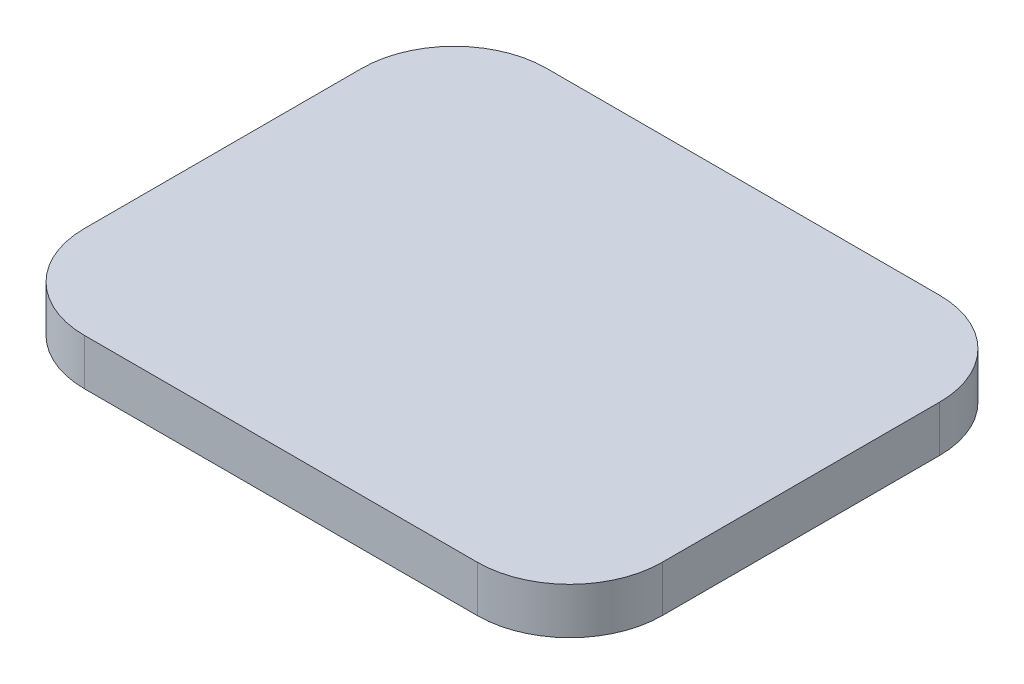
ISO-10303-21;
HEADER;
FILE_DESCRIPTION(('STEP AP214'),'2;1');
FILE_NAME('part.step','',(''),(''),'','','');
FILE_SCHEMA(('AUTOMOTIVE_DESIGN { 1 0 10303 214 1 1 1 1 }'));
ENDSEC;
DATA;
#1=APPLICATION_CONTEXT('core data for automotive mechanical design processes');
#2=APPLICATION_PROTOCOL_DEFINITION('international standard','automotive_design',2000,#1);
#3=PRODUCT_CONTEXT('',#1,'mechanical');
#4=PRODUCT('Part','Part','',(#3));
#5=PRODUCT_RELATED_PRODUCT_CATEGORY('part','',(#4));
#6=PRODUCT_DEFINITION_FORMATION('','',#4);
#7=PRODUCT_DEFINITION_CONTEXT('part definition',#1,'design');
#8=PRODUCT_DEFINITION('design','',#6,#7);
#9=PRODUCT_DEFINITION_SHAPE('','',#8);
#10=(LENGTH_UNIT() NAMED_UNIT(*) SI_UNIT(.MILLI.,.METRE.));
#11=(NAMED_UNIT(*) PLANE_ANGLE_UNIT() SI_UNIT($,.RADIAN.));
#12=(NAMED_UNIT(*) SI_UNIT($,.STERADIAN.) SOLID_ANGLE_UNIT());
#13=UNCERTAINTY_MEASURE_WITH_UNIT(LENGTH_MEASURE(1.E-05),#10,'distance_accuracy_value','');
#14=(GEOMETRIC_REPRESENTATION_CONTEXT(3) GLOBAL_UNCERTAINTY_ASSIGNED_CONTEXT((#13)) GLOBAL_UNIT_ASSIGNED_CONTEXT((#10,
#11,#12)) REPRESENTATION_CONTEXT('',''));
#15=CARTESIAN_POINT('',(0.,0.,0.));
#16=DIRECTION('',(0.,0.,1.));
#17=DIRECTION('',(1.,0.,0.));
#18=AXIS2_PLACEMENT_3D('',#15,#16,#17);
#19=CARTESIAN_POINT('',(12.5,2.,-10.));
#20=DIRECTION('',(-1.,0.,0.));
#21=DIRECTION('',(0.,0.,1.));
#22=AXIS2_PLACEMENT_3D('',#19,#20,#21);
#23=PLANE('',#22);
#24=DIRECTION('',(0.,0.,-1.));
#25=VECTOR('',#24,1.);
#26=CARTESIAN_POINT('',(12.5,0.,-10.));
#27=LINE('',#26,#25);
#28=CARTESIAN_POINT('',(12.5,0.,6.));
#29=VERTEX_POINT('',#28);
#30=CARTESIAN_POINT('',(12.5,0.,-6.));
#31=VERTEX_POINT('',#30);
#32=EDGE_CURVE('E144',#29,#31,#27,.T.);
#33=ORIENTED_EDGE('',*,*,#32,.T.);
#34=DIRECTION('',(0.,-1.,0.));
#35=VECTOR('',#34,1.);
#36=CARTESIAN_POINT('',(12.5,2.,-6.));
#37=LINE('',#36,#35);
#38=CARTESIAN_POINT('',(12.5,2.,-6.));
#39=VERTEX_POINT('',#38);
#40=EDGE_CURVE('E178',#31,#39,#37,.F.);
#41=ORIENTED_EDGE('',*,*,#40,.T.);
#42=DIRECTION('',(0.,0.,-1.));
#43=VECTOR('',#42,1.);
#44=CARTESIAN_POINT('',(12.5,2.,-10.));
#45=LINE('',#44,#43);
#46=CARTESIAN_POINT('',(12.5,2.,6.));
#47=VERTEX_POINT('',#46);
#48=EDGE_CURVE('E142',#47,#39,#45,.T.);
#49=ORIENTED_EDGE('',*,*,#48,.F.);
#50=DIRECTION('',(0.,-1.,0.));
#51=VECTOR('',#50,1.);
#52=CARTESIAN_POINT('',(12.5,2.,6.));
#53=LINE('',#52,#51);
#54=EDGE_CURVE('E174',#47,#29,#53,.T.);
#55=ORIENTED_EDGE('',*,*,#54,.T.);
#56=EDGE_LOOP('',(#33,#41,#49,#55));
#57=FACE_BOUND('',#56,.T.);
#58=ADVANCED_FACE('F43',(#57),#23,.F.);
#59=CARTESIAN_POINT('',(-12.5,2.,-10.));
#60=DIRECTION('',(0.,0.,1.));
#61=DIRECTION('',(1.,0.,0.));
#62=AXIS2_PLACEMENT_3D('',#59,#60,#61);
#63=PLANE('',#62);
#64=DIRECTION('',(-1.,0.,0.));
#65=VECTOR('',#64,1.);
#66=CARTESIAN_POINT('',(-12.5,0.,-10.));
#67=LINE('',#66,#65);
#68=CARTESIAN_POINT('',(8.49999999999999,0.,-10.));
#69=VERTEX_POINT('',#68);
#70=CARTESIAN_POINT('',(-8.5,0.,-10.));
#71=VERTEX_POINT('',#70);
#72=EDGE_CURVE('E138',#69,#71,#67,.T.);
#73=ORIENTED_EDGE('',*,*,#72,.T.);
#74=DIRECTION('',(0.,-1.,0.));
#75=VECTOR('',#74,1.);
#76=CARTESIAN_POINT('',(-8.5,2.,-10.));
#77=LINE('',#76,#75);
#78=CARTESIAN_POINT('',(-8.5,2.,-10.));
#79=VERTEX_POINT('',#78);
#80=EDGE_CURVE('E114',#71,#79,#77,.F.);
#81=ORIENTED_EDGE('',*,*,#80,.T.);
#82=DIRECTION('',(-1.,0.,0.));
#83=VECTOR('',#82,1.);
#84=CARTESIAN_POINT('',(-12.5,2.,-10.));
#85=LINE('',#84,#83);
#86=CARTESIAN_POINT('',(8.49999999999999,2.,-10.));
#87=VERTEX_POINT('',#86);
#88=EDGE_CURVE('E197',#87,#79,#85,.T.);
#89=ORIENTED_EDGE('',*,*,#88,.F.);
#90=DIRECTION('',(0.,-1.,0.));
#91=VECTOR('',#90,1.);
#92=CARTESIAN_POINT('',(8.5,2.,-10.));
#93=LINE('',#92,#91);
#94=EDGE_CURVE('E120',#87,#69,#93,.T.);
#95=ORIENTED_EDGE('',*,*,#94,.T.);
#96=EDGE_LOOP('',(#73,#81,#89,#95));
#97=FACE_BOUND('',#96,.T.);
#98=ADVANCED_FACE('F218',(#97),#63,.F.);
#99=CARTESIAN_POINT('',(-12.5,2.,-10.));
#100=DIRECTION('',(1.,0.,0.));
#101=DIRECTION('',(0.,0.,-1.));
#102=AXIS2_PLACEMENT_3D('',#99,#100,#101);
#103=PLANE('',#102);
#104=DIRECTION('',(0.,0.,1.));
#105=VECTOR('',#104,1.);
#106=CARTESIAN_POINT('',(-12.5,2.,-10.));
#107=LINE('',#106,#105);
#108=CARTESIAN_POINT('',(-12.5,2.,-6.));
#109=VERTEX_POINT('',#108);
#110=CARTESIAN_POINT('',(-12.5,2.,6.));
#111=VERTEX_POINT('',#110);
#112=EDGE_CURVE('E129',#109,#111,#107,.T.);
#113=ORIENTED_EDGE('',*,*,#112,.F.);
#114=DIRECTION('',(0.,-1.,0.));
#115=VECTOR('',#114,1.);
#116=CARTESIAN_POINT('',(-12.5,2.,-6.));
#117=LINE('',#116,#115);
#118=CARTESIAN_POINT('',(-12.5,0.,-6.));
#119=VERTEX_POINT('',#118);
#120=EDGE_CURVE('E113',#109,#119,#117,.T.);
#121=ORIENTED_EDGE('',*,*,#120,.T.);
#122=DIRECTION('',(0.,0.,1.));
#123=VECTOR('',#122,1.);
#124=CARTESIAN_POINT('',(-12.5,0.,-10.));
#125=LINE('',#124,#123);
#126=CARTESIAN_POINT('',(-12.5,0.,6.));
#127=VERTEX_POINT('',#126);
#128=EDGE_CURVE('E127',#119,#127,#125,.T.);
#129=ORIENTED_EDGE('',*,*,#128,.T.);
#130=DIRECTION('',(0.,-1.,0.));
#131=VECTOR('',#130,1.);
#132=CARTESIAN_POINT('',(-12.5,2.,6.));
#133=LINE('',#132,#131);
#134=EDGE_CURVE('E132',#127,#111,#133,.F.);
#135=ORIENTED_EDGE('',*,*,#134,.T.);
#136=EDGE_LOOP('',(#113,#121,#129,#135));
#137=FACE_BOUND('',#136,.T.);
#138=ADVANCED_FACE('F126',(#137),#103,.F.);
#139=CARTESIAN_POINT('',(-12.5,2.,10.));
#140=DIRECTION('',(0.,0.,-1.));
#141=DIRECTION('',(-1.,0.,0.));
#142=AXIS2_PLACEMENT_3D('',#139,#140,#141);
#143=PLANE('',#142);
#144=DIRECTION('',(1.,0.,0.));
#145=VECTOR('',#144,1.);
#146=CARTESIAN_POINT('',(-12.5,0.,10.));
#147=LINE('',#146,#145);
#148=CARTESIAN_POINT('',(-8.5,0.,10.));
#149=VERTEX_POINT('',#148);
#150=CARTESIAN_POINT('',(8.5,0.,10.));
#151=VERTEX_POINT('',#150);
#152=EDGE_CURVE('E137',#149,#151,#147,.T.);
#153=ORIENTED_EDGE('',*,*,#152,.T.);
#154=DIRECTION('',(0.,-1.,0.));
#155=VECTOR('',#154,1.);
#156=CARTESIAN_POINT('',(8.5,2.,10.));
#157=LINE('',#156,#155);
#158=CARTESIAN_POINT('',(8.5,2.,10.));
#159=VERTEX_POINT('',#158);
#160=EDGE_CURVE('E11',#151,#159,#157,.F.);
#161=ORIENTED_EDGE('',*,*,#160,.T.);
#162=DIRECTION('',(1.,0.,0.));
#163=VECTOR('',#162,1.);
#164=CARTESIAN_POINT('',(-12.5,2.,10.));
#165=LINE('',#164,#163);
#166=CARTESIAN_POINT('',(-8.5,2.,10.));
#167=VERTEX_POINT('',#166);
#168=EDGE_CURVE('E149',#167,#159,#165,.T.);
#169=ORIENTED_EDGE('',*,*,#168,.F.);
#170=DIRECTION('',(0.,-1.,0.));
#171=VECTOR('',#170,1.);
#172=CARTESIAN_POINT('',(-8.5,2.,10.));
#173=LINE('',#172,#171);
#174=EDGE_CURVE('E52',#167,#149,#173,.T.);
#175=ORIENTED_EDGE('',*,*,#174,.T.);
#176=EDGE_LOOP('',(#153,#161,#169,#175));
#177=FACE_BOUND('',#176,.T.);
#178=ADVANCED_FACE('F183',(#177),#143,.F.);
#179=CARTESIAN_POINT('',(0.,2.,0.));
#180=DIRECTION('',(0.,1.,0.));
#181=DIRECTION('',(0.,0.,1.));
#182=AXIS2_PLACEMENT_3D('',#179,#180,#181);
#183=PLANE('',#182);
#184=ORIENTED_EDGE('',*,*,#88,.T.);
#185=CARTESIAN_POINT('',(-8.5,2.,-6.));
#186=DIRECTION('',(0.,1.,0.));
#187=DIRECTION('',(0.,0.,1.));
#188=AXIS2_PLACEMENT_3D('',#185,#186,#187);
#189=CIRCLE('',#188,4.);
#190=EDGE_CURVE('E171',#79,#109,#189,.T.);
#191=ORIENTED_EDGE('',*,*,#190,.T.);
#192=ORIENTED_EDGE('',*,*,#112,.T.);
#193=CARTESIAN_POINT('',(-8.5,2.,6.));
#194=DIRECTION('',(0.,1.,0.));
#195=DIRECTION('',(0.,0.,1.));
#196=AXIS2_PLACEMENT_3D('',#193,#194,#195);
#197=CIRCLE('',#196,4.);
#198=EDGE_CURVE('E64',#111,#167,#197,.T.);
#199=ORIENTED_EDGE('',*,*,#198,.T.);
#200=ORIENTED_EDGE('',*,*,#168,.T.);
#201=CARTESIAN_POINT('',(8.5,2.,6.00000000000001));
#202=DIRECTION('',(0.,1.,0.));
#203=DIRECTION('',(0.,0.,1.));
#204=AXIS2_PLACEMENT_3D('',#201,#202,#203);
#205=CIRCLE('',#204,4.);
#206=EDGE_CURVE('E165',#159,#47,#205,.T.);
#207=ORIENTED_EDGE('',*,*,#206,.T.);
#208=ORIENTED_EDGE('',*,*,#48,.T.);
#209=CARTESIAN_POINT('',(8.5,2.,-6.));
#210=DIRECTION('',(0.,1.,0.));
#211=DIRECTION('',(0.,0.,1.));
#212=AXIS2_PLACEMENT_3D('',#209,#210,#211);
#213=CIRCLE('',#212,4.);
#214=EDGE_CURVE('E168',#39,#87,#213,.T.);
#215=ORIENTED_EDGE('',*,*,#214,.T.);
#216=EDGE_LOOP('',(#184,#191,#192,#199,#200,#207,#208,#215));
#217=FACE_BOUND('',#216,.T.);
#218=ADVANCED_FACE('F207',(#217),#183,.T.);
#219=CARTESIAN_POINT('',(0.,0.,0.));
#220=DIRECTION('',(0.,1.,0.));
#221=DIRECTION('',(0.,0.,1.));
#222=AXIS2_PLACEMENT_3D('',#219,#220,#221);
#223=PLANE('',#222);
#224=ORIENTED_EDGE('',*,*,#128,.F.);
#225=CARTESIAN_POINT('',(-8.5,0.,-6.));
#226=DIRECTION('',(0.,1.,0.));
#227=DIRECTION('',(0.,0.,1.));
#228=AXIS2_PLACEMENT_3D('',#225,#226,#227);
#229=CIRCLE('',#228,4.);
#230=EDGE_CURVE('E109',#119,#71,#229,.F.);
#231=ORIENTED_EDGE('',*,*,#230,.T.);
#232=ORIENTED_EDGE('',*,*,#72,.F.);
#233=CARTESIAN_POINT('',(8.5,0.,-6.));
#234=DIRECTION('',(0.,1.,0.));
#235=DIRECTION('',(0.,0.,1.));
#236=AXIS2_PLACEMENT_3D('',#233,#234,#235);
#237=CIRCLE('',#236,4.);
#238=EDGE_CURVE('E121',#69,#31,#237,.F.);
#239=ORIENTED_EDGE('',*,*,#238,.T.);
#240=ORIENTED_EDGE('',*,*,#32,.F.);
#241=CARTESIAN_POINT('',(8.5,0.,6.00000000000001));
#242=DIRECTION('',(0.,1.,0.));
#243=DIRECTION('',(0.,0.,1.));
#244=AXIS2_PLACEMENT_3D('',#241,#242,#243);
#245=CIRCLE('',#244,4.);
#246=EDGE_CURVE('E153',#29,#151,#245,.F.);
#247=ORIENTED_EDGE('',*,*,#246,.T.);
#248=ORIENTED_EDGE('',*,*,#152,.F.);
#249=CARTESIAN_POINT('',(-8.5,0.,6.));
#250=DIRECTION('',(0.,1.,0.));
#251=DIRECTION('',(0.,0.,1.));
#252=AXIS2_PLACEMENT_3D('',#249,#250,#251);
#253=CIRCLE('',#252,4.);
#254=EDGE_CURVE('E131',#149,#127,#253,.F.);
#255=ORIENTED_EDGE('',*,*,#254,.T.);
#256=EDGE_LOOP('',(#224,#231,#232,#239,#240,#247,#248,#255));
#257=FACE_BOUND('',#256,.T.);
#258=ADVANCED_FACE('F134',(#257),#223,.F.);
#259=CARTESIAN_POINT('',(-8.5,2.,-6.));
#260=DIRECTION('',(0.,-1.,0.));
#261=DIRECTION('',(0.,0.,-1.));
#262=AXIS2_PLACEMENT_3D('',#259,#260,#261);
#263=CYLINDRICAL_SURFACE('',#262,4.);
#264=ORIENTED_EDGE('',*,*,#190,.F.);
#265=ORIENTED_EDGE('',*,*,#80,.F.);
#266=ORIENTED_EDGE('',*,*,#230,.F.);
#267=ORIENTED_EDGE('',*,*,#120,.F.);
#268=EDGE_LOOP('',(#264,#265,#266,#267));
#269=FACE_BOUND('',#268,.T.);
#270=ADVANCED_FACE('F112',(#269),#263,.T.);
#271=CARTESIAN_POINT('',(8.5,2.,-6.));
#272=DIRECTION('',(0.,-1.,0.));
#273=DIRECTION('',(0.,0.,-1.));
#274=AXIS2_PLACEMENT_3D('',#271,#272,#273);
#275=CYLINDRICAL_SURFACE('',#274,4.);
#276=ORIENTED_EDGE('',*,*,#214,.F.);
#277=ORIENTED_EDGE('',*,*,#40,.F.);
#278=ORIENTED_EDGE('',*,*,#238,.F.);
#279=ORIENTED_EDGE('',*,*,#94,.F.);
#280=EDGE_LOOP('',(#276,#277,#278,#279));
#281=FACE_BOUND('',#280,.T.);
#282=ADVANCED_FACE('F229',(#281),#275,.T.);
#283=CARTESIAN_POINT('',(8.5,2.,6.00000000000001));
#284=DIRECTION('',(0.,-1.,0.));
#285=DIRECTION('',(0.,0.,-1.));
#286=AXIS2_PLACEMENT_3D('',#283,#284,#285);
#287=CYLINDRICAL_SURFACE('',#286,4.);
#288=ORIENTED_EDGE('',*,*,#206,.F.);
#289=ORIENTED_EDGE('',*,*,#160,.F.);
#290=ORIENTED_EDGE('',*,*,#246,.F.);
#291=ORIENTED_EDGE('',*,*,#54,.F.);
#292=EDGE_LOOP('',(#288,#289,#290,#291));
#293=FACE_BOUND('',#292,.T.);
#294=ADVANCED_FACE('F190',(#293),#287,.T.);
#295=CARTESIAN_POINT('',(-8.5,2.,6.));
#296=DIRECTION('',(0.,-1.,0.));
#297=DIRECTION('',(0.,0.,-1.));
#298=AXIS2_PLACEMENT_3D('',#295,#296,#297);
#299=CYLINDRICAL_SURFACE('',#298,4.);
#300=ORIENTED_EDGE('',*,*,#198,.F.);
#301=ORIENTED_EDGE('',*,*,#134,.F.);
#302=ORIENTED_EDGE('',*,*,#254,.F.);
#303=ORIENTED_EDGE('',*,*,#174,.F.);
#304=EDGE_LOOP('',(#300,#301,#302,#303));
#305=FACE_BOUND('',#304,.T.);
#306=ADVANCED_FACE('F45',(#305),#299,.T.);
#307=CLOSED_SHELL('',(#58,#98,#138,#178,#218,#258,#270,#282,#294,#306));
#308=MANIFOLD_SOLID_BREP('B2',#307);
#309=ADVANCED_BREP_SHAPE_REPRESENTATION('',(#18,#308),#14);
#310=SHAPE_DEFINITION_REPRESENTATION(#9,#309);
ENDSEC;
END-ISO-10303-21;
